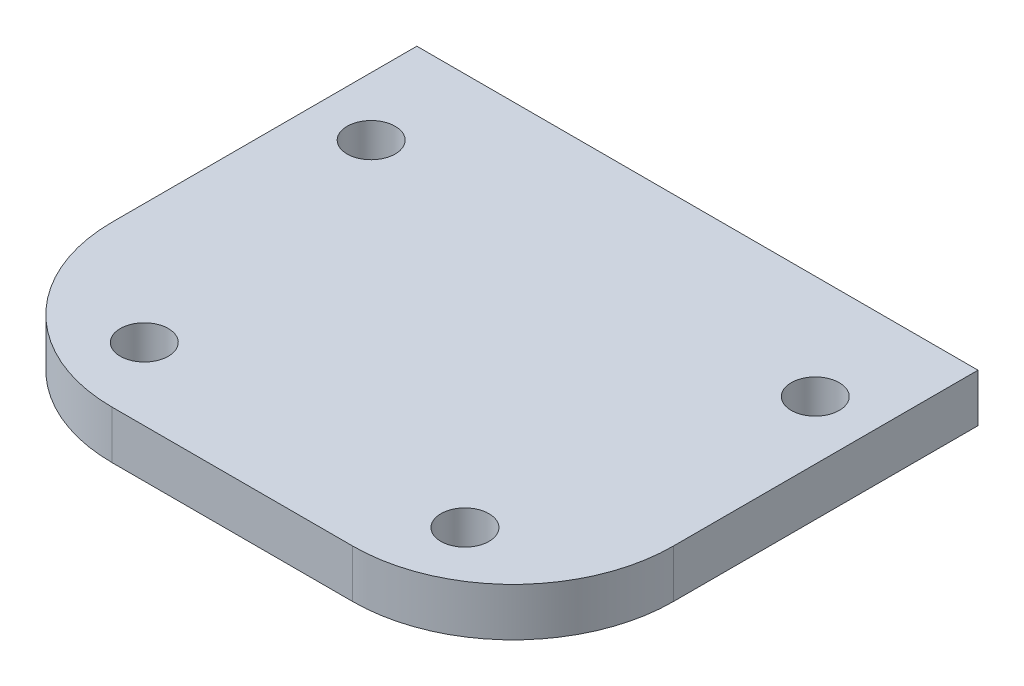
ISO-10303-21;
HEADER;
FILE_DESCRIPTION(('STEP AP214'),'2;1');
FILE_NAME('part.step','',(''),(''),'','','');
FILE_SCHEMA(('AUTOMOTIVE_DESIGN { 1 0 10303 214 1 1 1 1 }'));
ENDSEC;
DATA;
#1=APPLICATION_CONTEXT('core data for automotive mechanical design processes');
#2=APPLICATION_PROTOCOL_DEFINITION('international standard','automotive_design',2000,#1);
#3=PRODUCT_CONTEXT('',#1,'mechanical');
#4=PRODUCT('Part','Part','',(#3));
#5=PRODUCT_RELATED_PRODUCT_CATEGORY('part','',(#4));
#6=PRODUCT_DEFINITION_FORMATION('','',#4);
#7=PRODUCT_DEFINITION_CONTEXT('part definition',#1,'design');
#8=PRODUCT_DEFINITION('design','',#6,#7);
#9=PRODUCT_DEFINITION_SHAPE('','',#8);
#10=(LENGTH_UNIT() NAMED_UNIT(*) SI_UNIT(.MILLI.,.METRE.));
#11=(NAMED_UNIT(*) PLANE_ANGLE_UNIT() SI_UNIT($,.RADIAN.));
#12=(NAMED_UNIT(*) SI_UNIT($,.STERADIAN.) SOLID_ANGLE_UNIT());
#13=UNCERTAINTY_MEASURE_WITH_UNIT(LENGTH_MEASURE(1.E-05),#10,'distance_accuracy_value','');
#14=(GEOMETRIC_REPRESENTATION_CONTEXT(3) GLOBAL_UNCERTAINTY_ASSIGNED_CONTEXT((#13)) GLOBAL_UNIT_ASSIGNED_CONTEXT((#10,
#11,#12)) REPRESENTATION_CONTEXT('',''));
#15=CARTESIAN_POINT('',(0.,0.,0.));
#16=DIRECTION('',(0.,0.,1.));
#17=DIRECTION('',(1.,0.,0.));
#18=AXIS2_PLACEMENT_3D('',#15,#16,#17);
#19=CARTESIAN_POINT('',(0.,3.,0.));
#20=DIRECTION('',(0.,1.,0.));
#21=DIRECTION('',(0.,0.,1.));
#22=AXIS2_PLACEMENT_3D('',#19,#20,#21);
#23=PLANE('',#22);
#24=DIRECTION('',(0.,0.,1.));
#25=VECTOR('',#24,1.);
#26=CARTESIAN_POINT('',(-17.5,3.,0.));
#27=LINE('',#26,#25);
#28=CARTESIAN_POINT('',(-17.5,3.,12.5));
#29=VERTEX_POINT('',#28);
#30=CARTESIAN_POINT('',(-17.5,3.,-6.5));
#31=VERTEX_POINT('',#30);
#32=EDGE_CURVE('E71',#29,#31,#27,.F.);
#33=ORIENTED_EDGE('',*,*,#32,.F.);
#34=CARTESIAN_POINT('',(-7.5,3.,12.5));
#35=DIRECTION('',(0.,-1.,0.));
#36=DIRECTION('',(0.,0.,-1.));
#37=AXIS2_PLACEMENT_3D('',#34,#35,#36);
#38=CIRCLE('',#37,10.);
#39=CARTESIAN_POINT('',(-7.5,3.,22.5));
#40=VERTEX_POINT('',#39);
#41=EDGE_CURVE('E65',#40,#29,#38,.T.);
#42=ORIENTED_EDGE('',*,*,#41,.F.);
#43=DIRECTION('',(1.,0.,0.));
#44=VECTOR('',#43,1.);
#45=CARTESIAN_POINT('',(0.,3.,22.5));
#46=LINE('',#45,#44);
#47=CARTESIAN_POINT('',(7.49999999999999,3.,22.5));
#48=VERTEX_POINT('',#47);
#49=EDGE_CURVE('E59',#48,#40,#46,.F.);
#50=ORIENTED_EDGE('',*,*,#49,.F.);
#51=CARTESIAN_POINT('',(7.49999999999999,3.,12.5));
#52=DIRECTION('',(0.,1.,0.));
#53=DIRECTION('',(0.,0.,1.));
#54=AXIS2_PLACEMENT_3D('',#51,#52,#53);
#55=CIRCLE('',#54,10.);
#56=CARTESIAN_POINT('',(17.5,3.,12.5));
#57=VERTEX_POINT('',#56);
#58=EDGE_CURVE('E164',#57,#48,#55,.F.);
#59=ORIENTED_EDGE('',*,*,#58,.F.);
#60=DIRECTION('',(0.,0.,1.));
#61=VECTOR('',#60,1.);
#62=CARTESIAN_POINT('',(17.5,3.,0.));
#63=LINE('',#62,#61);
#64=CARTESIAN_POINT('',(17.5,3.,-6.5));
#65=VERTEX_POINT('',#64);
#66=EDGE_CURVE('E169',#57,#65,#63,.F.);
#67=ORIENTED_EDGE('',*,*,#66,.T.);
#68=DIRECTION('',(-1.,0.,0.));
#69=VECTOR('',#68,1.);
#70=CARTESIAN_POINT('',(0.,3.,-6.5));
#71=LINE('',#70,#69);
#72=EDGE_CURVE('E97',#31,#65,#71,.F.);
#73=ORIENTED_EDGE('',*,*,#72,.F.);
#74=EDGE_LOOP('',(#33,#42,#50,#59,#67,#73));
#75=FACE_BOUND('',#74,.T.);
#76=CARTESIAN_POINT('',(13.85,3.,0.));
#77=DIRECTION('',(0.,-1.,0.));
#78=DIRECTION('',(0.,0.,-1.));
#79=AXIS2_PLACEMENT_3D('',#76,#77,#78);
#80=CIRCLE('',#79,1.5);
#81=CARTESIAN_POINT('',(13.85,3.,-1.5));
#82=VERTEX_POINT('',#81);
#83=EDGE_CURVE('E156',#82,#82,#80,.T.);
#84=ORIENTED_EDGE('',*,*,#83,.T.);
#85=EDGE_LOOP('',(#84));
#86=FACE_BOUND('',#85,.T.);
#87=CARTESIAN_POINT('',(-13.85,3.,0.));
#88=DIRECTION('',(0.,-1.,0.));
#89=DIRECTION('',(0.,0.,-1.));
#90=AXIS2_PLACEMENT_3D('',#87,#88,#89);
#91=CIRCLE('',#90,1.5);
#92=CARTESIAN_POINT('',(-13.85,3.,-1.5));
#93=VERTEX_POINT('',#92);
#94=EDGE_CURVE('E152',#93,#93,#91,.T.);
#95=ORIENTED_EDGE('',*,*,#94,.T.);
#96=EDGE_LOOP('',(#95));
#97=FACE_BOUND('',#96,.T.);
#98=CARTESIAN_POINT('',(-10.,3.,18.));
#99=DIRECTION('',(0.,-1.,0.));
#100=DIRECTION('',(0.,0.,-1.));
#101=AXIS2_PLACEMENT_3D('',#98,#99,#100);
#102=CIRCLE('',#101,1.5);
#103=CARTESIAN_POINT('',(-10.,3.,16.5));
#104=VERTEX_POINT('',#103);
#105=EDGE_CURVE('E150',#104,#104,#102,.T.);
#106=ORIENTED_EDGE('',*,*,#105,.T.);
#107=EDGE_LOOP('',(#106));
#108=FACE_BOUND('',#107,.T.);
#109=CARTESIAN_POINT('',(10.,3.,18.));
#110=DIRECTION('',(0.,-1.,0.));
#111=DIRECTION('',(0.,0.,-1.));
#112=AXIS2_PLACEMENT_3D('',#109,#110,#111);
#113=CIRCLE('',#112,1.5);
#114=CARTESIAN_POINT('',(10.,3.,16.5));
#115=VERTEX_POINT('',#114);
#116=EDGE_CURVE('E20',#115,#115,#113,.T.);
#117=ORIENTED_EDGE('',*,*,#116,.T.);
#118=EDGE_LOOP('',(#117));
#119=FACE_BOUND('',#118,.T.);
#120=ADVANCED_FACE('F17',(#75,#86,#97,#108,#119),#23,.T.);
#121=CARTESIAN_POINT('',(10.,3.,18.));
#122=DIRECTION('',(0.,-1.,0.));
#123=DIRECTION('',(0.,0.,-1.));
#124=AXIS2_PLACEMENT_3D('',#121,#122,#123);
#125=CYLINDRICAL_SURFACE('',#124,1.5);
#126=CARTESIAN_POINT('',(10.,0.,18.));
#127=DIRECTION('',(0.,-1.,0.));
#128=DIRECTION('',(0.,0.,-1.));
#129=AXIS2_PLACEMENT_3D('',#126,#127,#128);
#130=CIRCLE('',#129,1.5);
#131=CARTESIAN_POINT('',(10.,0.,16.5));
#132=VERTEX_POINT('',#131);
#133=EDGE_CURVE('E146',#132,#132,#130,.T.);
#134=ORIENTED_EDGE('',*,*,#133,.T.);
#135=EDGE_LOOP('',(#134));
#136=FACE_BOUND('',#135,.T.);
#137=ORIENTED_EDGE('',*,*,#116,.F.);
#138=EDGE_LOOP('',(#137));
#139=FACE_BOUND('',#138,.T.);
#140=ADVANCED_FACE('F135',(#136,#139),#125,.F.);
#141=CARTESIAN_POINT('',(-10.,3.,18.));
#142=DIRECTION('',(0.,-1.,0.));
#143=DIRECTION('',(0.,0.,-1.));
#144=AXIS2_PLACEMENT_3D('',#141,#142,#143);
#145=CYLINDRICAL_SURFACE('',#144,1.5);
#146=CARTESIAN_POINT('',(-10.,0.,18.));
#147=DIRECTION('',(0.,-1.,0.));
#148=DIRECTION('',(0.,0.,-1.));
#149=AXIS2_PLACEMENT_3D('',#146,#147,#148);
#150=CIRCLE('',#149,1.5);
#151=CARTESIAN_POINT('',(-10.,0.,16.5));
#152=VERTEX_POINT('',#151);
#153=EDGE_CURVE('E168',#152,#152,#150,.T.);
#154=ORIENTED_EDGE('',*,*,#153,.T.);
#155=EDGE_LOOP('',(#154));
#156=FACE_BOUND('',#155,.T.);
#157=ORIENTED_EDGE('',*,*,#105,.F.);
#158=EDGE_LOOP('',(#157));
#159=FACE_BOUND('',#158,.T.);
#160=ADVANCED_FACE('F132',(#156,#159),#145,.F.);
#161=CARTESIAN_POINT('',(-13.85,3.,0.));
#162=DIRECTION('',(0.,-1.,0.));
#163=DIRECTION('',(0.,0.,-1.));
#164=AXIS2_PLACEMENT_3D('',#161,#162,#163);
#165=CYLINDRICAL_SURFACE('',#164,1.5);
#166=CARTESIAN_POINT('',(-13.85,0.,0.));
#167=DIRECTION('',(0.,-1.,0.));
#168=DIRECTION('',(0.,0.,-1.));
#169=AXIS2_PLACEMENT_3D('',#166,#167,#168);
#170=CIRCLE('',#169,1.5);
#171=CARTESIAN_POINT('',(-13.85,0.,-1.5));
#172=VERTEX_POINT('',#171);
#173=EDGE_CURVE('E172',#172,#172,#170,.T.);
#174=ORIENTED_EDGE('',*,*,#173,.T.);
#175=EDGE_LOOP('',(#174));
#176=FACE_BOUND('',#175,.T.);
#177=ORIENTED_EDGE('',*,*,#94,.F.);
#178=EDGE_LOOP('',(#177));
#179=FACE_BOUND('',#178,.T.);
#180=ADVANCED_FACE('F128',(#176,#179),#165,.F.);
#181=CARTESIAN_POINT('',(13.85,3.,0.));
#182=DIRECTION('',(0.,-1.,0.));
#183=DIRECTION('',(0.,0.,-1.));
#184=AXIS2_PLACEMENT_3D('',#181,#182,#183);
#185=CYLINDRICAL_SURFACE('',#184,1.5);
#186=CARTESIAN_POINT('',(13.85,0.,0.));
#187=DIRECTION('',(0.,-1.,0.));
#188=DIRECTION('',(0.,0.,-1.));
#189=AXIS2_PLACEMENT_3D('',#186,#187,#188);
#190=CIRCLE('',#189,1.5);
#191=CARTESIAN_POINT('',(13.85,0.,-1.5));
#192=VERTEX_POINT('',#191);
#193=EDGE_CURVE('E92',#192,#192,#190,.T.);
#194=ORIENTED_EDGE('',*,*,#193,.T.);
#195=EDGE_LOOP('',(#194));
#196=FACE_BOUND('',#195,.T.);
#197=ORIENTED_EDGE('',*,*,#83,.F.);
#198=EDGE_LOOP('',(#197));
#199=FACE_BOUND('',#198,.T.);
#200=ADVANCED_FACE('F125',(#196,#199),#185,.F.);
#201=CARTESIAN_POINT('',(0.,3.,-6.5));
#202=DIRECTION('',(0.,0.,-1.));
#203=DIRECTION('',(-1.,0.,0.));
#204=AXIS2_PLACEMENT_3D('',#201,#202,#203);
#205=PLANE('',#204);
#206=ORIENTED_EDGE('',*,*,#72,.T.);
#207=DIRECTION('',(0.,1.,0.));
#208=VECTOR('',#207,1.);
#209=CARTESIAN_POINT('',(17.5,3.,-6.5));
#210=LINE('',#209,#208);
#211=CARTESIAN_POINT('',(17.5,0.,-6.5));
#212=VERTEX_POINT('',#211);
#213=EDGE_CURVE('E95',#65,#212,#210,.F.);
#214=ORIENTED_EDGE('',*,*,#213,.T.);
#215=DIRECTION('',(1.,0.,0.));
#216=VECTOR('',#215,1.);
#217=CARTESIAN_POINT('',(0.,0.,-6.5));
#218=LINE('',#217,#216);
#219=CARTESIAN_POINT('',(-17.5,0.,-6.5));
#220=VERTEX_POINT('',#219);
#221=EDGE_CURVE('E81',#212,#220,#218,.F.);
#222=ORIENTED_EDGE('',*,*,#221,.T.);
#223=DIRECTION('',(0.,1.,0.));
#224=VECTOR('',#223,1.);
#225=CARTESIAN_POINT('',(-17.5,3.,-6.5));
#226=LINE('',#225,#224);
#227=EDGE_CURVE('E163',#31,#220,#226,.F.);
#228=ORIENTED_EDGE('',*,*,#227,.F.);
#229=EDGE_LOOP('',(#206,#214,#222,#228));
#230=FACE_BOUND('',#229,.T.);
#231=ADVANCED_FACE('F96',(#230),#205,.T.);
#232=CARTESIAN_POINT('',(-17.5,3.,0.));
#233=DIRECTION('',(-1.,0.,0.));
#234=DIRECTION('',(0.,0.,1.));
#235=AXIS2_PLACEMENT_3D('',#232,#233,#234);
#236=PLANE('',#235);
#237=ORIENTED_EDGE('',*,*,#32,.T.);
#238=ORIENTED_EDGE('',*,*,#227,.T.);
#239=DIRECTION('',(0.,0.,1.));
#240=VECTOR('',#239,1.);
#241=CARTESIAN_POINT('',(-17.5,0.,0.));
#242=LINE('',#241,#240);
#243=CARTESIAN_POINT('',(-17.5,0.,12.5));
#244=VERTEX_POINT('',#243);
#245=EDGE_CURVE('E89',#220,#244,#242,.T.);
#246=ORIENTED_EDGE('',*,*,#245,.T.);
#247=DIRECTION('',(0.,-1.,0.));
#248=VECTOR('',#247,1.);
#249=CARTESIAN_POINT('',(-17.5,3.,12.5));
#250=LINE('',#249,#248);
#251=EDGE_CURVE('E162',#29,#244,#250,.T.);
#252=ORIENTED_EDGE('',*,*,#251,.F.);
#253=EDGE_LOOP('',(#237,#238,#246,#252));
#254=FACE_BOUND('',#253,.T.);
#255=ADVANCED_FACE('F120',(#254),#236,.T.);
#256=CARTESIAN_POINT('',(-7.5,3.,12.5));
#257=DIRECTION('',(0.,-1.,0.));
#258=DIRECTION('',(0.,0.,-1.));
#259=AXIS2_PLACEMENT_3D('',#256,#257,#258);
#260=CYLINDRICAL_SURFACE('',#259,10.);
#261=CARTESIAN_POINT('',(-7.5,0.,12.5));
#262=DIRECTION('',(0.,-1.,0.));
#263=DIRECTION('',(0.,0.,-1.));
#264=AXIS2_PLACEMENT_3D('',#261,#262,#263);
#265=CIRCLE('',#264,10.);
#266=CARTESIAN_POINT('',(-7.5,0.,22.5));
#267=VERTEX_POINT('',#266);
#268=EDGE_CURVE('E177',#244,#267,#265,.F.);
#269=ORIENTED_EDGE('',*,*,#268,.T.);
#270=DIRECTION('',(0.,1.,0.));
#271=VECTOR('',#270,1.);
#272=CARTESIAN_POINT('',(-7.5,3.,22.5));
#273=LINE('',#272,#271);
#274=EDGE_CURVE('E166',#40,#267,#273,.F.);
#275=ORIENTED_EDGE('',*,*,#274,.F.);
#276=ORIENTED_EDGE('',*,*,#41,.T.);
#277=ORIENTED_EDGE('',*,*,#251,.T.);
#278=EDGE_LOOP('',(#269,#275,#276,#277));
#279=FACE_BOUND('',#278,.T.);
#280=ADVANCED_FACE('F117',(#279),#260,.T.);
#281=CARTESIAN_POINT('',(0.,3.,22.5));
#282=DIRECTION('',(0.,0.,1.));
#283=DIRECTION('',(1.,0.,0.));
#284=AXIS2_PLACEMENT_3D('',#281,#282,#283);
#285=PLANE('',#284);
#286=ORIENTED_EDGE('',*,*,#49,.T.);
#287=ORIENTED_EDGE('',*,*,#274,.T.);
#288=DIRECTION('',(1.,0.,0.));
#289=VECTOR('',#288,1.);
#290=CARTESIAN_POINT('',(0.,0.,22.5));
#291=LINE('',#290,#289);
#292=CARTESIAN_POINT('',(7.49999999999999,0.,22.5));
#293=VERTEX_POINT('',#292);
#294=EDGE_CURVE('E180',#267,#293,#291,.T.);
#295=ORIENTED_EDGE('',*,*,#294,.T.);
#296=DIRECTION('',(0.,1.,0.));
#297=VECTOR('',#296,1.);
#298=CARTESIAN_POINT('',(7.49999999999999,3.,22.5));
#299=LINE('',#298,#297);
#300=EDGE_CURVE('E99',#48,#293,#299,.F.);
#301=ORIENTED_EDGE('',*,*,#300,.F.);
#302=EDGE_LOOP('',(#286,#287,#295,#301));
#303=FACE_BOUND('',#302,.T.);
#304=ADVANCED_FACE('F111',(#303),#285,.T.);
#305=CARTESIAN_POINT('',(7.49999999999999,3.,12.5));
#306=DIRECTION('',(0.,1.,0.));
#307=DIRECTION('',(0.,0.,1.));
#308=AXIS2_PLACEMENT_3D('',#305,#306,#307);
#309=CYLINDRICAL_SURFACE('',#308,10.);
#310=CARTESIAN_POINT('',(7.49999999999999,0.,12.5));
#311=DIRECTION('',(0.,1.,0.));
#312=DIRECTION('',(0.,0.,1.));
#313=AXIS2_PLACEMENT_3D('',#310,#311,#312);
#314=CIRCLE('',#313,10.);
#315=CARTESIAN_POINT('',(17.5,0.,12.5));
#316=VERTEX_POINT('',#315);
#317=EDGE_CURVE('E26',#293,#316,#314,.T.);
#318=ORIENTED_EDGE('',*,*,#317,.T.);
#319=DIRECTION('',(0.,1.,0.));
#320=VECTOR('',#319,1.);
#321=CARTESIAN_POINT('',(17.5,3.,12.5));
#322=LINE('',#321,#320);
#323=EDGE_CURVE('E34',#316,#57,#322,.T.);
#324=ORIENTED_EDGE('',*,*,#323,.T.);
#325=ORIENTED_EDGE('',*,*,#58,.T.);
#326=ORIENTED_EDGE('',*,*,#300,.T.);
#327=EDGE_LOOP('',(#318,#324,#325,#326));
#328=FACE_BOUND('',#327,.T.);
#329=ADVANCED_FACE('F103',(#328),#309,.T.);
#330=CARTESIAN_POINT('',(17.5,3.,0.));
#331=DIRECTION('',(-1.,0.,0.));
#332=DIRECTION('',(0.,0.,1.));
#333=AXIS2_PLACEMENT_3D('',#330,#331,#332);
#334=PLANE('',#333);
#335=ORIENTED_EDGE('',*,*,#323,.F.);
#336=DIRECTION('',(0.,0.,1.));
#337=VECTOR('',#336,1.);
#338=CARTESIAN_POINT('',(17.5,0.,0.));
#339=LINE('',#338,#337);
#340=EDGE_CURVE('E11',#316,#212,#339,.F.);
#341=ORIENTED_EDGE('',*,*,#340,.T.);
#342=ORIENTED_EDGE('',*,*,#213,.F.);
#343=ORIENTED_EDGE('',*,*,#66,.F.);
#344=EDGE_LOOP('',(#335,#341,#342,#343));
#345=FACE_BOUND('',#344,.T.);
#346=ADVANCED_FACE('F101',(#345),#334,.F.);
#347=CARTESIAN_POINT('',(0.,0.,0.));
#348=DIRECTION('',(0.,1.,0.));
#349=DIRECTION('',(0.,0.,1.));
#350=AXIS2_PLACEMENT_3D('',#347,#348,#349);
#351=PLANE('',#350);
#352=ORIENTED_EDGE('',*,*,#317,.F.);
#353=ORIENTED_EDGE('',*,*,#294,.F.);
#354=ORIENTED_EDGE('',*,*,#268,.F.);
#355=ORIENTED_EDGE('',*,*,#245,.F.);
#356=ORIENTED_EDGE('',*,*,#221,.F.);
#357=ORIENTED_EDGE('',*,*,#340,.F.);
#358=EDGE_LOOP('',(#352,#353,#354,#355,#356,#357));
#359=FACE_BOUND('',#358,.T.);
#360=ORIENTED_EDGE('',*,*,#193,.F.);
#361=EDGE_LOOP('',(#360));
#362=FACE_BOUND('',#361,.T.);
#363=ORIENTED_EDGE('',*,*,#173,.F.);
#364=EDGE_LOOP('',(#363));
#365=FACE_BOUND('',#364,.T.);
#366=ORIENTED_EDGE('',*,*,#153,.F.);
#367=EDGE_LOOP('',(#366));
#368=FACE_BOUND('',#367,.T.);
#369=ORIENTED_EDGE('',*,*,#133,.F.);
#370=EDGE_LOOP('',(#369));
#371=FACE_BOUND('',#370,.T.);
#372=ADVANCED_FACE('F84',(#359,#362,#365,#368,#371),#351,.F.);
#373=CLOSED_SHELL('',(#120,#140,#160,#180,#200,#231,#255,#280,#304,#329,#346,#372));
#374=MANIFOLD_SOLID_BREP('B1',#373);
#375=ADVANCED_BREP_SHAPE_REPRESENTATION('',(#18,#374),#14);
#376=SHAPE_DEFINITION_REPRESENTATION(#9,#375);
ENDSEC;
END-ISO-10303-21;
